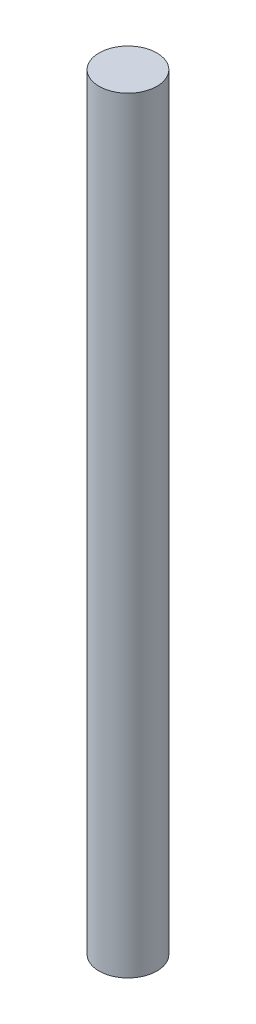
ISO-10303-21;
HEADER;
FILE_DESCRIPTION(('STEP AP214'),'2;1');
FILE_NAME('part.step','',(''),(''),'','','');
FILE_SCHEMA(('AUTOMOTIVE_DESIGN { 1 0 10303 214 1 1 1 1 }'));
ENDSEC;
DATA;
#1=APPLICATION_CONTEXT('core data for automotive mechanical design processes');
#2=APPLICATION_PROTOCOL_DEFINITION('international standard','automotive_design',2000,#1);
#3=PRODUCT_CONTEXT('',#1,'mechanical');
#4=PRODUCT('Part','Part','',(#3));
#5=PRODUCT_RELATED_PRODUCT_CATEGORY('part','',(#4));
#6=PRODUCT_DEFINITION_FORMATION('','',#4);
#7=PRODUCT_DEFINITION_CONTEXT('part definition',#1,'design');
#8=PRODUCT_DEFINITION('design','',#6,#7);
#9=PRODUCT_DEFINITION_SHAPE('','',#8);
#10=(LENGTH_UNIT() NAMED_UNIT(*) SI_UNIT(.MILLI.,.METRE.));
#11=(NAMED_UNIT(*) PLANE_ANGLE_UNIT() SI_UNIT($,.RADIAN.));
#12=(NAMED_UNIT(*) SI_UNIT($,.STERADIAN.) SOLID_ANGLE_UNIT());
#13=UNCERTAINTY_MEASURE_WITH_UNIT(LENGTH_MEASURE(1.E-05),#10,'distance_accuracy_value','');
#14=(GEOMETRIC_REPRESENTATION_CONTEXT(3) GLOBAL_UNCERTAINTY_ASSIGNED_CONTEXT((#13)) GLOBAL_UNIT_ASSIGNED_CONTEXT((#10,
#11,#12)) REPRESENTATION_CONTEXT('',''));
#15=CARTESIAN_POINT('',(0.,0.,0.));
#16=DIRECTION('',(0.,0.,1.));
#17=DIRECTION('',(1.,0.,0.));
#18=AXIS2_PLACEMENT_3D('',#15,#16,#17);
#19=CARTESIAN_POINT('',(0.,106.,0.));
#20=DIRECTION('',(0.,-1.,0.));
#21=DIRECTION('',(0.,0.,-1.));
#22=AXIS2_PLACEMENT_3D('',#19,#20,#21);
#23=CYLINDRICAL_SURFACE('',#22,4.);
#24=CARTESIAN_POINT('',(0.,106.,0.));
#25=DIRECTION('',(0.,1.,0.));
#26=DIRECTION('',(0.,0.,1.));
#27=AXIS2_PLACEMENT_3D('',#24,#25,#26);
#28=CIRCLE('',#27,4.);
#29=CARTESIAN_POINT('',(0.,106.,4.));
#30=VERTEX_POINT('',#29);
#31=EDGE_CURVE('E10',#30,#30,#28,.T.);
#32=ORIENTED_EDGE('',*,*,#31,.F.);
#33=EDGE_LOOP('',(#32));
#34=FACE_BOUND('',#33,.T.);
#35=CARTESIAN_POINT('',(0.,0.,0.));
#36=DIRECTION('',(0.,1.,0.));
#37=DIRECTION('',(0.,0.,1.));
#38=AXIS2_PLACEMENT_3D('',#35,#36,#37);
#39=CIRCLE('',#38,4.);
#40=CARTESIAN_POINT('',(0.,0.,4.));
#41=VERTEX_POINT('',#40);
#42=EDGE_CURVE('E43',#41,#41,#39,.T.);
#43=ORIENTED_EDGE('',*,*,#42,.T.);
#44=EDGE_LOOP('',(#43));
#45=FACE_BOUND('',#44,.T.);
#46=ADVANCED_FACE('F40',(#34,#45),#23,.T.);
#47=CARTESIAN_POINT('',(0.,106.,0.));
#48=DIRECTION('',(0.,1.,0.));
#49=DIRECTION('',(0.,0.,1.));
#50=AXIS2_PLACEMENT_3D('',#47,#48,#49);
#51=PLANE('',#50);
#52=ORIENTED_EDGE('',*,*,#31,.T.);
#53=EDGE_LOOP('',(#52));
#54=FACE_BOUND('',#53,.T.);
#55=ADVANCED_FACE('F55',(#54),#51,.T.);
#56=CARTESIAN_POINT('',(0.,0.,0.));
#57=DIRECTION('',(0.,1.,0.));
#58=DIRECTION('',(0.,0.,1.));
#59=AXIS2_PLACEMENT_3D('',#56,#57,#58);
#60=PLANE('',#59);
#61=ORIENTED_EDGE('',*,*,#42,.F.);
#62=EDGE_LOOP('',(#61));
#63=FACE_BOUND('',#62,.T.);
#64=ADVANCED_FACE('F53',(#63),#60,.F.);
#65=CLOSED_SHELL('',(#46,#55,#64));
#66=MANIFOLD_SOLID_BREP('B2',#65);
#67=ADVANCED_BREP_SHAPE_REPRESENTATION('',(#18,#66),#14);
#68=SHAPE_DEFINITION_REPRESENTATION(#9,#67);
ENDSEC;
END-ISO-10303-21;
